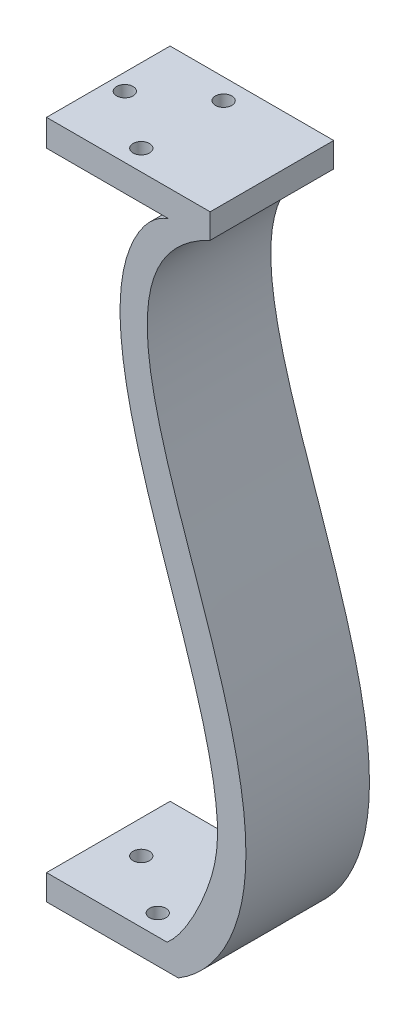
ISO-10303-21;
HEADER;
FILE_DESCRIPTION(('STEP AP214'),'2;1');
FILE_NAME('part.step','',(''),(''),'','','');
FILE_SCHEMA(('AUTOMOTIVE_DESIGN { 1 0 10303 214 1 1 1 1 }'));
ENDSEC;
DATA;
#1=APPLICATION_CONTEXT('core data for automotive mechanical design processes');
#2=APPLICATION_PROTOCOL_DEFINITION('international standard','automotive_design',2000,#1);
#3=PRODUCT_CONTEXT('',#1,'mechanical');
#4=PRODUCT('Part','Part','',(#3));
#5=PRODUCT_RELATED_PRODUCT_CATEGORY('part','',(#4));
#6=PRODUCT_DEFINITION_FORMATION('','',#4);
#7=PRODUCT_DEFINITION_CONTEXT('part definition',#1,'design');
#8=PRODUCT_DEFINITION('design','',#6,#7);
#9=PRODUCT_DEFINITION_SHAPE('','',#8);
#10=(LENGTH_UNIT() NAMED_UNIT(*) SI_UNIT(.MILLI.,.METRE.));
#11=(NAMED_UNIT(*) PLANE_ANGLE_UNIT() SI_UNIT($,.RADIAN.));
#12=(NAMED_UNIT(*) SI_UNIT($,.STERADIAN.) SOLID_ANGLE_UNIT());
#13=UNCERTAINTY_MEASURE_WITH_UNIT(LENGTH_MEASURE(1.E-05),#10,'distance_accuracy_value','');
#14=(GEOMETRIC_REPRESENTATION_CONTEXT(3) GLOBAL_UNCERTAINTY_ASSIGNED_CONTEXT((#13)) GLOBAL_UNIT_ASSIGNED_CONTEXT((#10,
#11,#12)) REPRESENTATION_CONTEXT('',''));
#15=CARTESIAN_POINT('',(0.,0.,0.));
#16=DIRECTION('',(0.,0.,1.));
#17=DIRECTION('',(1.,0.,0.));
#18=AXIS2_PLACEMENT_3D('',#15,#16,#17);
#19=CARTESIAN_POINT('',(0.,165.,-30.));
#20=DIRECTION('',(0.,0.,1.));
#21=DIRECTION('',(1.,0.,0.));
#22=AXIS2_PLACEMENT_3D('',#19,#20,#21);
#23=PLANE('',#22);
#24=DIRECTION('',(-1.,0.,0.));
#25=VECTOR('',#24,1.);
#26=CARTESIAN_POINT('',(0.,6.16560213056344,-30.));
#27=LINE('',#26,#25);
#28=CARTESIAN_POINT('',(-20.7198654493493,6.16560213056345,-30.));
#29=VERTEX_POINT('',#28);
#30=CARTESIAN_POINT('',(-50.,6.16560213056344,-30.));
#31=VERTEX_POINT('',#30);
#32=EDGE_CURVE('E48',#29,#31,#27,.T.);
#33=ORIENTED_EDGE('',*,*,#32,.F.);
#34=CARTESIAN_POINT('',(-20.7198654493493,6.16560213056345,-30.));
#35=CARTESIAN_POINT('',(-16.4171086317866,9.87986086313503,-30.));
#36=CARTESIAN_POINT('',(-8.59455584063185,25.2925313476993,-30.));
#37=CARTESIAN_POINT('',(-7.12445917762197,64.8232239319523,-30.));
#38=CARTESIAN_POINT('',(-46.2843782530998,128.924399550578,-30.));
#39=CARTESIAN_POINT('',(-24.2819890563055,157.156211749063,-30.));
#40=CARTESIAN_POINT('',(-20.3559258397296,158.5,-30.));
#41=B_SPLINE_CURVE_WITH_KNOTS('',3,(#34,#35,#36,#37,#38,#39,#40),.UNSPECIFIED.,.F.,.F.,(4,1,1,1,
4),(0.0525728869515312,0.159086781003664,0.252212072365428,0.902535386324314,1.),.UNSPECIFIED.);
#42=CARTESIAN_POINT('',(-20.3559258397296,158.5,-30.));
#43=VERTEX_POINT('',#42);
#44=EDGE_CURVE('E52',#43,#29,#41,.F.);
#45=ORIENTED_EDGE('',*,*,#44,.F.);
#46=DIRECTION('',(1.,0.,0.));
#47=VECTOR('',#46,1.);
#48=CARTESIAN_POINT('',(0.,158.5,-30.));
#49=LINE('',#48,#47);
#50=CARTESIAN_POINT('',(-50.,158.5,-30.));
#51=VERTEX_POINT('',#50);
#52=EDGE_CURVE('E210',#51,#43,#49,.T.);
#53=ORIENTED_EDGE('',*,*,#52,.F.);
#54=DIRECTION('',(0.,-1.,0.));
#55=VECTOR('',#54,1.);
#56=CARTESIAN_POINT('',(-50.,165.,-30.));
#57=LINE('',#56,#55);
#58=CARTESIAN_POINT('',(-50.,165.,-30.));
#59=VERTEX_POINT('',#58);
#60=EDGE_CURVE('E122',#59,#51,#57,.T.);
#61=ORIENTED_EDGE('',*,*,#60,.F.);
#62=DIRECTION('',(-1.,0.,0.));
#63=VECTOR('',#62,1.);
#64=CARTESIAN_POINT('',(0.,165.,-30.));
#65=LINE('',#64,#63);
#66=CARTESIAN_POINT('',(-10.2669307677797,165.,-30.));
#67=VERTEX_POINT('',#66);
#68=EDGE_CURVE('E141',#67,#59,#65,.T.);
#69=ORIENTED_EDGE('',*,*,#68,.F.);
#70=DIRECTION('',(0.,-1.,0.));
#71=VECTOR('',#70,1.);
#72=CARTESIAN_POINT('',(-10.2669307677797,159.,-30.));
#73=LINE('',#72,#71);
#74=CARTESIAN_POINT('',(-10.2669307677797,159.,-30.));
#75=VERTEX_POINT('',#74);
#76=EDGE_CURVE('E157',#67,#75,#73,.T.);
#77=ORIENTED_EDGE('',*,*,#76,.T.);
#78=CARTESIAN_POINT('',(-10.2669307677797,159.,-30.));
#79=CARTESIAN_POINT('',(-53.3339106429098,138.279185217186,-30.));
#80=CARTESIAN_POINT('',(21.0968658973275,53.2888857987778,-30.));
#81=CARTESIAN_POINT('',(-10.655091279707,4.43253750573491,-30.));
#82=CARTESIAN_POINT('',(-18.,0.,-30.));
#83=B_SPLINE_CURVE_WITH_KNOTS('',3,(#78,#79,#80,#81,#82),.UNSPECIFIED.,.F.,.F.,(4,1,4),(0.,
0.846823903806327,1.),.UNSPECIFIED.);
#84=CARTESIAN_POINT('',(-18.,0.,-30.));
#85=VERTEX_POINT('',#84);
#86=EDGE_CURVE('E163',#75,#85,#83,.T.);
#87=ORIENTED_EDGE('',*,*,#86,.T.);
#88=DIRECTION('',(-1.,0.,0.));
#89=VECTOR('',#88,1.);
#90=CARTESIAN_POINT('',(0.,0.,-30.));
#91=LINE('',#90,#89);
#92=CARTESIAN_POINT('',(-50.,0.,-30.));
#93=VERTEX_POINT('',#92);
#94=EDGE_CURVE('E145',#85,#93,#91,.T.);
#95=ORIENTED_EDGE('',*,*,#94,.T.);
#96=EDGE_CURVE('E114',#31,#93,#57,.T.);
#97=ORIENTED_EDGE('',*,*,#96,.F.);
#98=EDGE_LOOP('',(#33,#45,#53,#61,#69,#77,#87,#95,#97));
#99=FACE_BOUND('',#98,.T.);
#100=ADVANCED_FACE('F34',(#99),#23,.F.);
#101=CARTESIAN_POINT('',(-50.,165.,0.));
#102=DIRECTION('',(1.,0.,0.));
#103=DIRECTION('',(0.,0.,-1.));
#104=AXIS2_PLACEMENT_3D('',#101,#102,#103);
#105=PLANE('',#104);
#106=DIRECTION('',(0.,0.,-1.));
#107=VECTOR('',#106,1.);
#108=CARTESIAN_POINT('',(-50.,6.16560213056344,257.402973582958));
#109=LINE('',#108,#107);
#110=CARTESIAN_POINT('',(-50.,6.16560213056344,0.));
#111=VERTEX_POINT('',#110);
#112=EDGE_CURVE('E208',#111,#31,#109,.T.);
#113=ORIENTED_EDGE('',*,*,#112,.T.);
#114=ORIENTED_EDGE('',*,*,#96,.T.);
#115=DIRECTION('',(0.,0.,1.));
#116=VECTOR('',#115,1.);
#117=CARTESIAN_POINT('',(-50.,0.,0.));
#118=LINE('',#117,#116);
#119=CARTESIAN_POINT('',(-50.,0.,0.));
#120=VERTEX_POINT('',#119);
#121=EDGE_CURVE('E142',#93,#120,#118,.T.);
#122=ORIENTED_EDGE('',*,*,#121,.T.);
#123=DIRECTION('',(0.,-1.,0.));
#124=VECTOR('',#123,1.);
#125=CARTESIAN_POINT('',(-50.,165.,0.));
#126=LINE('',#125,#124);
#127=EDGE_CURVE('E115',#111,#120,#126,.T.);
#128=ORIENTED_EDGE('',*,*,#127,.F.);
#129=EDGE_LOOP('',(#113,#114,#122,#128));
#130=FACE_BOUND('',#129,.T.);
#131=ADVANCED_FACE('F199',(#130),#105,.F.);
#132=DIRECTION('',(0.,0.,-1.));
#133=VECTOR('',#132,1.);
#134=CARTESIAN_POINT('',(-50.,158.5,257.402973582958));
#135=LINE('',#134,#133);
#136=CARTESIAN_POINT('',(-50.,158.5,0.));
#137=VERTEX_POINT('',#136);
#138=EDGE_CURVE('E119',#137,#51,#135,.T.);
#139=ORIENTED_EDGE('',*,*,#138,.F.);
#140=CARTESIAN_POINT('',(-50.,165.,0.));
#141=VERTEX_POINT('',#140);
#142=EDGE_CURVE('E103',#141,#137,#126,.T.);
#143=ORIENTED_EDGE('',*,*,#142,.F.);
#144=DIRECTION('',(0.,0.,1.));
#145=VECTOR('',#144,1.);
#146=CARTESIAN_POINT('',(-50.,165.,0.));
#147=LINE('',#146,#145);
#148=EDGE_CURVE('E150',#59,#141,#147,.T.);
#149=ORIENTED_EDGE('',*,*,#148,.F.);
#150=ORIENTED_EDGE('',*,*,#60,.T.);
#151=EDGE_LOOP('',(#139,#143,#149,#150));
#152=FACE_BOUND('',#151,.T.);
#153=ADVANCED_FACE('F120',(#152),#105,.F.);
#154=CARTESIAN_POINT('',(0.,165.,0.));
#155=DIRECTION('',(0.,0.,-1.));
#156=DIRECTION('',(-1.,0.,0.));
#157=AXIS2_PLACEMENT_3D('',#154,#155,#156);
#158=PLANE('',#157);
#159=DIRECTION('',(1.,0.,0.));
#160=VECTOR('',#159,1.);
#161=CARTESIAN_POINT('',(0.,6.16560213056344,0.));
#162=LINE('',#161,#160);
#163=CARTESIAN_POINT('',(-20.7198654493493,6.16560213056345,0.));
#164=VERTEX_POINT('',#163);
#165=EDGE_CURVE('E11',#111,#164,#162,.T.);
#166=ORIENTED_EDGE('',*,*,#165,.F.);
#167=ORIENTED_EDGE('',*,*,#127,.T.);
#168=DIRECTION('',(1.,0.,0.));
#169=VECTOR('',#168,1.);
#170=CARTESIAN_POINT('',(0.,0.,0.));
#171=LINE('',#170,#169);
#172=CARTESIAN_POINT('',(-18.,0.,0.));
#173=VERTEX_POINT('',#172);
#174=EDGE_CURVE('E138',#120,#173,#171,.T.);
#175=ORIENTED_EDGE('',*,*,#174,.T.);
#176=CARTESIAN_POINT('',(-10.2669307677797,159.,0.));
#177=CARTESIAN_POINT('',(-53.3339106429098,138.279185217186,0.));
#178=CARTESIAN_POINT('',(21.0968658973275,53.2888857987778,0.));
#179=CARTESIAN_POINT('',(-10.655091279707,4.43253750573491,0.));
#180=CARTESIAN_POINT('',(-18.,0.,0.));
#181=B_SPLINE_CURVE_WITH_KNOTS('',3,(#176,#177,#178,#179,#180),.UNSPECIFIED.,.F.,.F.,(4,1,4),
(0.,0.846823903806327,1.),.UNSPECIFIED.);
#182=CARTESIAN_POINT('',(-10.2669307677797,159.,0.));
#183=VERTEX_POINT('',#182);
#184=EDGE_CURVE('E164',#183,#173,#181,.T.);
#185=ORIENTED_EDGE('',*,*,#184,.F.);
#186=DIRECTION('',(0.,-1.,0.));
#187=VECTOR('',#186,1.);
#188=CARTESIAN_POINT('',(-10.2669307677797,159.,0.));
#189=LINE('',#188,#187);
#190=CARTESIAN_POINT('',(-10.2669307677797,165.,0.));
#191=VERTEX_POINT('',#190);
#192=EDGE_CURVE('E160',#191,#183,#189,.T.);
#193=ORIENTED_EDGE('',*,*,#192,.F.);
#194=DIRECTION('',(1.,0.,0.));
#195=VECTOR('',#194,1.);
#196=CARTESIAN_POINT('',(0.,165.,0.));
#197=LINE('',#196,#195);
#198=EDGE_CURVE('E111',#141,#191,#197,.T.);
#199=ORIENTED_EDGE('',*,*,#198,.F.);
#200=ORIENTED_EDGE('',*,*,#142,.T.);
#201=DIRECTION('',(-1.,0.,0.));
#202=VECTOR('',#201,1.);
#203=CARTESIAN_POINT('',(0.,158.5,0.));
#204=LINE('',#203,#202);
#205=CARTESIAN_POINT('',(-20.3559258397296,158.5,0.));
#206=VERTEX_POINT('',#205);
#207=EDGE_CURVE('E107',#206,#137,#204,.T.);
#208=ORIENTED_EDGE('',*,*,#207,.F.);
#209=CARTESIAN_POINT('',(-20.7198654493493,6.16560213056345,0.));
#210=CARTESIAN_POINT('',(-16.4171086317866,9.87986086313503,0.));
#211=CARTESIAN_POINT('',(-8.59455584063185,25.2925313476993,0.));
#212=CARTESIAN_POINT('',(-7.12445917762197,64.8232239319523,0.));
#213=CARTESIAN_POINT('',(-46.2843782530998,128.924399550578,0.));
#214=CARTESIAN_POINT('',(-24.2819890563055,157.156211749063,0.));
#215=CARTESIAN_POINT('',(-20.3559258397296,158.5,0.));
#216=B_SPLINE_CURVE_WITH_KNOTS('',3,(#209,#210,#211,#212,#213,#214,#215),.UNSPECIFIED.,.F.,.F.,
(4,1,1,1,4),(0.0525728869515312,0.159086781003664,0.252212072365428,0.902535386324314,1.),.UNSPECIFIED.);
#217=EDGE_CURVE('E41',#164,#206,#216,.T.);
#218=ORIENTED_EDGE('',*,*,#217,.F.);
#219=EDGE_LOOP('',(#166,#167,#175,#185,#193,#199,#200,#208,#218));
#220=FACE_BOUND('',#219,.T.);
#221=ADVANCED_FACE('F105',(#220),#158,.F.);
#222=CARTESIAN_POINT('',(0.,165.,0.));
#223=DIRECTION('',(0.,1.,0.));
#224=DIRECTION('',(0.,0.,1.));
#225=AXIS2_PLACEMENT_3D('',#222,#223,#224);
#226=PLANE('',#225);
#227=CARTESIAN_POINT('',(-32.,165.,-4.99999999999999));
#228=DIRECTION('',(0.,1.,0.));
#229=DIRECTION('',(0.,0.,1.));
#230=AXIS2_PLACEMENT_3D('',#227,#228,#229);
#231=CIRCLE('',#230,2.);
#232=CARTESIAN_POINT('',(-32.,165.,-2.99999999999999));
#233=VERTEX_POINT('',#232);
#234=EDGE_CURVE('E283',#233,#233,#231,.T.);
#235=ORIENTED_EDGE('',*,*,#234,.F.);
#236=EDGE_LOOP('',(#235));
#237=FACE_BOUND('',#236,.T.);
#238=CARTESIAN_POINT('',(-32.,165.,-25.));
#239=DIRECTION('',(0.,1.,0.));
#240=DIRECTION('',(0.,0.,1.));
#241=AXIS2_PLACEMENT_3D('',#238,#239,#240);
#242=CIRCLE('',#241,2.);
#243=CARTESIAN_POINT('',(-32.,165.,-23.));
#244=VERTEX_POINT('',#243);
#245=EDGE_CURVE('E277',#244,#244,#242,.T.);
#246=ORIENTED_EDGE('',*,*,#245,.F.);
#247=EDGE_LOOP('',(#246));
#248=FACE_BOUND('',#247,.T.);
#249=CARTESIAN_POINT('',(-46.,165.,-15.));
#250=DIRECTION('',(0.,1.,0.));
#251=DIRECTION('',(0.,0.,1.));
#252=AXIS2_PLACEMENT_3D('',#249,#250,#251);
#253=CIRCLE('',#252,2.);
#254=CARTESIAN_POINT('',(-46.,165.,-13.));
#255=VERTEX_POINT('',#254);
#256=EDGE_CURVE('E270',#255,#255,#253,.T.);
#257=ORIENTED_EDGE('',*,*,#256,.F.);
#258=EDGE_LOOP('',(#257));
#259=FACE_BOUND('',#258,.T.);
#260=DIRECTION('',(0.,0.,1.));
#261=VECTOR('',#260,1.);
#262=CARTESIAN_POINT('',(-10.2669307677797,165.,-30.));
#263=LINE('',#262,#261);
#264=EDGE_CURVE('E156',#67,#191,#263,.T.);
#265=ORIENTED_EDGE('',*,*,#264,.F.);
#266=ORIENTED_EDGE('',*,*,#68,.T.);
#267=ORIENTED_EDGE('',*,*,#148,.T.);
#268=ORIENTED_EDGE('',*,*,#198,.T.);
#269=EDGE_LOOP('',(#265,#266,#267,#268));
#270=FACE_BOUND('',#269,.T.);
#271=ADVANCED_FACE('F191',(#237,#248,#259,#270),#226,.T.);
#272=CARTESIAN_POINT('',(0.,0.,0.));
#273=DIRECTION('',(0.,1.,0.));
#274=DIRECTION('',(0.,0.,1.));
#275=AXIS2_PLACEMENT_3D('',#272,#273,#274);
#276=PLANE('',#275);
#277=CARTESIAN_POINT('',(-28.,0.,-4.99999999999999));
#278=DIRECTION('',(0.,-1.,0.));
#279=DIRECTION('',(0.,0.,1.));
#280=AXIS2_PLACEMENT_3D('',#277,#278,#279);
#281=CIRCLE('',#280,2.);
#282=CARTESIAN_POINT('',(-28.,0.,-2.99999999999999));
#283=VERTEX_POINT('',#282);
#284=EDGE_CURVE('E266',#283,#283,#281,.T.);
#285=ORIENTED_EDGE('',*,*,#284,.F.);
#286=EDGE_LOOP('',(#285));
#287=FACE_BOUND('',#286,.T.);
#288=CARTESIAN_POINT('',(-28.,0.,-25.));
#289=DIRECTION('',(0.,-1.,0.));
#290=DIRECTION('',(0.,0.,-1.));
#291=AXIS2_PLACEMENT_3D('',#288,#289,#290);
#292=CIRCLE('',#291,2.);
#293=CARTESIAN_POINT('',(-28.,0.,-27.));
#294=VERTEX_POINT('',#293);
#295=EDGE_CURVE('E260',#294,#294,#292,.T.);
#296=ORIENTED_EDGE('',*,*,#295,.F.);
#297=EDGE_LOOP('',(#296));
#298=FACE_BOUND('',#297,.T.);
#299=CARTESIAN_POINT('',(-42.,0.,-15.));
#300=DIRECTION('',(0.,-1.,0.));
#301=DIRECTION('',(0.,0.,-1.));
#302=AXIS2_PLACEMENT_3D('',#299,#300,#301);
#303=CIRCLE('',#302,2.);
#304=CARTESIAN_POINT('',(-42.,0.,-17.));
#305=VERTEX_POINT('',#304);
#306=EDGE_CURVE('E226',#305,#305,#303,.T.);
#307=ORIENTED_EDGE('',*,*,#306,.F.);
#308=EDGE_LOOP('',(#307));
#309=FACE_BOUND('',#308,.T.);
#310=ORIENTED_EDGE('',*,*,#94,.F.);
#311=DIRECTION('',(0.,0.,1.));
#312=VECTOR('',#311,1.);
#313=CARTESIAN_POINT('',(-18.,0.,-30.));
#314=LINE('',#313,#312);
#315=EDGE_CURVE('E153',#85,#173,#314,.T.);
#316=ORIENTED_EDGE('',*,*,#315,.T.);
#317=ORIENTED_EDGE('',*,*,#174,.F.);
#318=ORIENTED_EDGE('',*,*,#121,.F.);
#319=EDGE_LOOP('',(#310,#316,#317,#318));
#320=FACE_BOUND('',#319,.T.);
#321=ADVANCED_FACE('F188',(#287,#298,#309,#320),#276,.F.);
#322=DIRECTION('',(0.,0.,1.));
#323=VECTOR('',#322,1.);
#324=SURFACE_OF_LINEAR_EXTRUSION('',#83,#323);
#325=ORIENTED_EDGE('',*,*,#184,.T.);
#326=ORIENTED_EDGE('',*,*,#315,.F.);
#327=ORIENTED_EDGE('',*,*,#86,.F.);
#328=DIRECTION('',(0.,0.,1.));
#329=VECTOR('',#328,1.);
#330=CARTESIAN_POINT('',(-10.2669307677797,159.,-30.));
#331=LINE('',#330,#329);
#332=EDGE_CURVE('E148',#75,#183,#331,.T.);
#333=ORIENTED_EDGE('',*,*,#332,.T.);
#334=EDGE_LOOP('',(#325,#326,#327,#333));
#335=FACE_BOUND('',#334,.T.);
#336=ADVANCED_FACE('F183',(#335),#324,.F.);
#337=CARTESIAN_POINT('',(-10.2669307677797,159.,-30.));
#338=DIRECTION('',(-1.,0.,0.));
#339=DIRECTION('',(0.,0.,1.));
#340=AXIS2_PLACEMENT_3D('',#337,#338,#339);
#341=PLANE('',#340);
#342=ORIENTED_EDGE('',*,*,#192,.T.);
#343=ORIENTED_EDGE('',*,*,#332,.F.);
#344=ORIENTED_EDGE('',*,*,#76,.F.);
#345=ORIENTED_EDGE('',*,*,#264,.T.);
#346=EDGE_LOOP('',(#342,#343,#344,#345));
#347=FACE_BOUND('',#346,.T.);
#348=ADVANCED_FACE('F187',(#347),#341,.F.);
#349=CARTESIAN_POINT('',(-20.7198654493493,6.16560213056345,257.402973582958));
#350=DIRECTION('',(0.,1.,0.));
#351=DIRECTION('',(-1.,0.,0.));
#352=AXIS2_PLACEMENT_3D('',#349,#350,#351);
#353=PLANE('',#352);
#354=CARTESIAN_POINT('',(-28.,6.16560213056344,-4.99999999999999));
#355=DIRECTION('',(0.,1.,0.));
#356=DIRECTION('',(-1.,0.,0.));
#357=AXIS2_PLACEMENT_3D('',#354,#355,#356);
#358=CIRCLE('',#357,2.);
#359=CARTESIAN_POINT('',(-30.,6.16560213056344,-4.99999999999999));
#360=VERTEX_POINT('',#359);
#361=EDGE_CURVE('E251',#360,#360,#358,.F.);
#362=ORIENTED_EDGE('',*,*,#361,.T.);
#363=EDGE_LOOP('',(#362));
#364=FACE_BOUND('',#363,.T.);
#365=CARTESIAN_POINT('',(-28.,6.16560213056344,-25.));
#366=DIRECTION('',(0.,1.,0.));
#367=DIRECTION('',(-1.,0.,0.));
#368=AXIS2_PLACEMENT_3D('',#365,#366,#367);
#369=CIRCLE('',#368,2.);
#370=CARTESIAN_POINT('',(-30.,6.16560213056344,-25.));
#371=VERTEX_POINT('',#370);
#372=EDGE_CURVE('E255',#371,#371,#369,.F.);
#373=ORIENTED_EDGE('',*,*,#372,.T.);
#374=EDGE_LOOP('',(#373));
#375=FACE_BOUND('',#374,.T.);
#376=CARTESIAN_POINT('',(-42.,6.16560213056344,-15.));
#377=DIRECTION('',(0.,1.,0.));
#378=DIRECTION('',(-1.,0.,0.));
#379=AXIS2_PLACEMENT_3D('',#376,#377,#378);
#380=CIRCLE('',#379,2.);
#381=CARTESIAN_POINT('',(-44.,6.16560213056344,-15.));
#382=VERTEX_POINT('',#381);
#383=EDGE_CURVE('E258',#382,#382,#380,.F.);
#384=ORIENTED_EDGE('',*,*,#383,.T.);
#385=EDGE_LOOP('',(#384));
#386=FACE_BOUND('',#385,.T.);
#387=DIRECTION('',(0.,0.,-1.));
#388=VECTOR('',#387,1.);
#389=CARTESIAN_POINT('',(-20.7198654493493,6.16560213056345,257.402973582958));
#390=LINE('',#389,#388);
#391=EDGE_CURVE('E124',#164,#29,#390,.T.);
#392=ORIENTED_EDGE('',*,*,#391,.T.);
#393=ORIENTED_EDGE('',*,*,#32,.T.);
#394=ORIENTED_EDGE('',*,*,#112,.F.);
#395=ORIENTED_EDGE('',*,*,#165,.T.);
#396=EDGE_LOOP('',(#392,#393,#394,#395));
#397=FACE_BOUND('',#396,.T.);
#398=ADVANCED_FACE('F215',(#364,#375,#386,#397),#353,.T.);
#399=CARTESIAN_POINT('',(-20.7198654493493,6.16560213056345,257.402973582958));
#400=CARTESIAN_POINT('',(-16.4171086317866,9.87986086313503,257.402973582958));
#401=CARTESIAN_POINT('',(-8.59455584063185,25.2925313476993,257.402973582958));
#402=CARTESIAN_POINT('',(-7.12445917762197,64.8232239319523,257.402973582958));
#403=CARTESIAN_POINT('',(-46.2843782530998,128.924399550578,257.402973582958));
#404=CARTESIAN_POINT('',(-24.2819890563055,157.156211749063,257.402973582958));
#405=CARTESIAN_POINT('',(-20.3559258397296,158.5,257.402973582958));
#406=B_SPLINE_CURVE_WITH_KNOTS('',3,(#399,#400,#401,#402,#403,#404,#405),.UNSPECIFIED.,.F.,.F.,
(4,1,1,1,4),(0.0525728869515312,0.159086781003664,0.252212072365428,0.902535386324314,1.),.UNSPECIFIED.);
#407=DIRECTION('',(0.,0.,-1.));
#408=VECTOR('',#407,1.);
#409=SURFACE_OF_LINEAR_EXTRUSION('',#406,#408);
#410=DIRECTION('',(0.,0.,-1.));
#411=VECTOR('',#410,1.);
#412=CARTESIAN_POINT('',(-20.3559258397296,158.5,257.402973582958));
#413=LINE('',#412,#411);
#414=EDGE_CURVE('E125',#206,#43,#413,.T.);
#415=ORIENTED_EDGE('',*,*,#414,.T.);
#416=ORIENTED_EDGE('',*,*,#44,.T.);
#417=ORIENTED_EDGE('',*,*,#391,.F.);
#418=ORIENTED_EDGE('',*,*,#217,.T.);
#419=EDGE_LOOP('',(#415,#416,#417,#418));
#420=FACE_BOUND('',#419,.T.);
#421=ADVANCED_FACE('F237',(#420),#409,.T.);
#422=CARTESIAN_POINT('',(-20.3559258397297,158.5,257.402973582958));
#423=DIRECTION('',(0.,-1.,0.));
#424=DIRECTION('',(0.,0.,-1.));
#425=AXIS2_PLACEMENT_3D('',#422,#423,#424);
#426=PLANE('',#425);
#427=CARTESIAN_POINT('',(-32.,158.5,-4.99999999999999));
#428=DIRECTION('',(0.,-1.,0.));
#429=DIRECTION('',(0.,0.,-1.));
#430=AXIS2_PLACEMENT_3D('',#427,#428,#429);
#431=CIRCLE('',#430,2.);
#432=CARTESIAN_POINT('',(-32.,158.5,-7.));
#433=VERTEX_POINT('',#432);
#434=EDGE_CURVE('E280',#433,#433,#431,.F.);
#435=ORIENTED_EDGE('',*,*,#434,.T.);
#436=EDGE_LOOP('',(#435));
#437=FACE_BOUND('',#436,.T.);
#438=CARTESIAN_POINT('',(-32.,158.5,-25.));
#439=DIRECTION('',(0.,-1.,0.));
#440=DIRECTION('',(0.,0.,-1.));
#441=AXIS2_PLACEMENT_3D('',#438,#439,#440);
#442=CIRCLE('',#441,2.);
#443=CARTESIAN_POINT('',(-32.,158.5,-27.));
#444=VERTEX_POINT('',#443);
#445=EDGE_CURVE('E274',#444,#444,#442,.F.);
#446=ORIENTED_EDGE('',*,*,#445,.T.);
#447=EDGE_LOOP('',(#446));
#448=FACE_BOUND('',#447,.T.);
#449=CARTESIAN_POINT('',(-46.,158.5,-15.));
#450=DIRECTION('',(0.,-1.,0.));
#451=DIRECTION('',(0.,0.,-1.));
#452=AXIS2_PLACEMENT_3D('',#449,#450,#451);
#453=CIRCLE('',#452,2.);
#454=CARTESIAN_POINT('',(-46.,158.5,-17.));
#455=VERTEX_POINT('',#454);
#456=EDGE_CURVE('E271',#455,#455,#453,.F.);
#457=ORIENTED_EDGE('',*,*,#456,.T.);
#458=EDGE_LOOP('',(#457));
#459=FACE_BOUND('',#458,.T.);
#460=ORIENTED_EDGE('',*,*,#138,.T.);
#461=ORIENTED_EDGE('',*,*,#52,.T.);
#462=ORIENTED_EDGE('',*,*,#414,.F.);
#463=ORIENTED_EDGE('',*,*,#207,.T.);
#464=EDGE_LOOP('',(#460,#461,#462,#463));
#465=FACE_BOUND('',#464,.T.);
#466=ADVANCED_FACE('F128',(#437,#448,#459,#465),#426,.T.);
#467=CARTESIAN_POINT('',(-42.,165.001,-15.));
#468=DIRECTION('',(0.,-1.,0.));
#469=DIRECTION('',(0.,0.,-1.));
#470=AXIS2_PLACEMENT_3D('',#467,#468,#469);
#471=CYLINDRICAL_SURFACE('',#470,2.);
#472=ORIENTED_EDGE('',*,*,#383,.F.);
#473=EDGE_LOOP('',(#472));
#474=FACE_BOUND('',#473,.T.);
#475=ORIENTED_EDGE('',*,*,#306,.T.);
#476=EDGE_LOOP('',(#475));
#477=FACE_BOUND('',#476,.T.);
#478=ADVANCED_FACE('F326',(#474,#477),#471,.F.);
#479=CARTESIAN_POINT('',(-28.,165.001,-25.));
#480=DIRECTION('',(0.,-1.,0.));
#481=DIRECTION('',(0.,0.,-1.));
#482=AXIS2_PLACEMENT_3D('',#479,#480,#481);
#483=CYLINDRICAL_SURFACE('',#482,2.);
#484=ORIENTED_EDGE('',*,*,#372,.F.);
#485=EDGE_LOOP('',(#484));
#486=FACE_BOUND('',#485,.T.);
#487=ORIENTED_EDGE('',*,*,#295,.T.);
#488=EDGE_LOOP('',(#487));
#489=FACE_BOUND('',#488,.T.);
#490=ADVANCED_FACE('F320',(#486,#489),#483,.F.);
#491=CARTESIAN_POINT('',(-28.,165.001,-4.99999999999999));
#492=DIRECTION('',(0.,-1.,0.));
#493=DIRECTION('',(0.,0.,-1.));
#494=AXIS2_PLACEMENT_3D('',#491,#492,#493);
#495=CYLINDRICAL_SURFACE('',#494,2.);
#496=ORIENTED_EDGE('',*,*,#361,.F.);
#497=EDGE_LOOP('',(#496));
#498=FACE_BOUND('',#497,.T.);
#499=ORIENTED_EDGE('',*,*,#284,.T.);
#500=EDGE_LOOP('',(#499));
#501=FACE_BOUND('',#500,.T.);
#502=ADVANCED_FACE('F311',(#498,#501),#495,.F.);
#503=CARTESIAN_POINT('',(-46.,-0.001000000000001,-15.));
#504=DIRECTION('',(0.,1.,0.));
#505=DIRECTION('',(0.,0.,1.));
#506=AXIS2_PLACEMENT_3D('',#503,#504,#505);
#507=CYLINDRICAL_SURFACE('',#506,2.);
#508=ORIENTED_EDGE('',*,*,#456,.F.);
#509=EDGE_LOOP('',(#508));
#510=FACE_BOUND('',#509,.T.);
#511=ORIENTED_EDGE('',*,*,#256,.T.);
#512=EDGE_LOOP('',(#511));
#513=FACE_BOUND('',#512,.T.);
#514=ADVANCED_FACE('F309',(#510,#513),#507,.F.);
#515=CARTESIAN_POINT('',(-32.,-0.001000000000001,-25.));
#516=DIRECTION('',(0.,1.,0.));
#517=DIRECTION('',(0.,0.,1.));
#518=AXIS2_PLACEMENT_3D('',#515,#516,#517);
#519=CYLINDRICAL_SURFACE('',#518,2.);
#520=ORIENTED_EDGE('',*,*,#445,.F.);
#521=EDGE_LOOP('',(#520));
#522=FACE_BOUND('',#521,.T.);
#523=ORIENTED_EDGE('',*,*,#245,.T.);
#524=EDGE_LOOP('',(#523));
#525=FACE_BOUND('',#524,.T.);
#526=ADVANCED_FACE('F294',(#522,#525),#519,.F.);
#527=CARTESIAN_POINT('',(-32.,-0.001000000000001,-4.99999999999999));
#528=DIRECTION('',(0.,1.,0.));
#529=DIRECTION('',(0.,0.,1.));
#530=AXIS2_PLACEMENT_3D('',#527,#528,#529);
#531=CYLINDRICAL_SURFACE('',#530,2.);
#532=ORIENTED_EDGE('',*,*,#434,.F.);
#533=EDGE_LOOP('',(#532));
#534=FACE_BOUND('',#533,.T.);
#535=ORIENTED_EDGE('',*,*,#234,.T.);
#536=EDGE_LOOP('',(#535));
#537=FACE_BOUND('',#536,.T.);
#538=ADVANCED_FACE('F291',(#534,#537),#531,.F.);
#539=CLOSED_SHELL('',(#100,#131,#153,#221,#271,#321,#336,#348,#398,#421,#466,#478,#490,#502,
#514,#526,#538));
#540=MANIFOLD_SOLID_BREP('B2',#539);
#541=ADVANCED_BREP_SHAPE_REPRESENTATION('',(#18,#540),#14);
#542=SHAPE_DEFINITION_REPRESENTATION(#9,#541);
ENDSEC;
END-ISO-10303-21;
